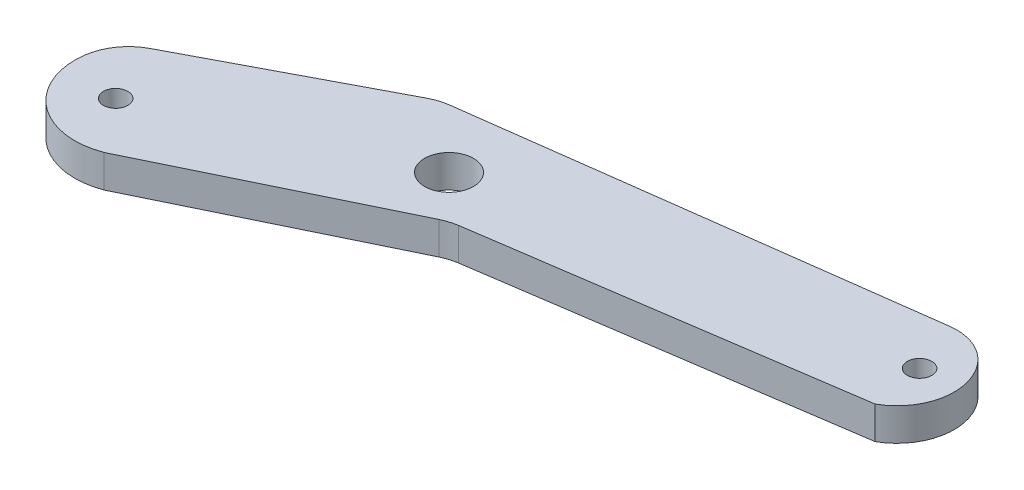
ISO-10303-21;
HEADER;
FILE_DESCRIPTION(('STEP AP214'),'2;1');
FILE_NAME('part.step','',(''),(''),'','','');
FILE_SCHEMA(('AUTOMOTIVE_DESIGN { 1 0 10303 214 1 1 1 1 }'));
ENDSEC;
DATA;
#1=APPLICATION_CONTEXT('core data for automotive mechanical design processes');
#2=APPLICATION_PROTOCOL_DEFINITION('international standard','automotive_design',2000,#1);
#3=PRODUCT_CONTEXT('',#1,'mechanical');
#4=PRODUCT('Part','Part','',(#3));
#5=PRODUCT_RELATED_PRODUCT_CATEGORY('part','',(#4));
#6=PRODUCT_DEFINITION_FORMATION('','',#4);
#7=PRODUCT_DEFINITION_CONTEXT('part definition',#1,'design');
#8=PRODUCT_DEFINITION('design','',#6,#7);
#9=PRODUCT_DEFINITION_SHAPE('','',#8);
#10=(LENGTH_UNIT() NAMED_UNIT(*) SI_UNIT(.MILLI.,.METRE.));
#11=(NAMED_UNIT(*) PLANE_ANGLE_UNIT() SI_UNIT($,.RADIAN.));
#12=(NAMED_UNIT(*) SI_UNIT($,.STERADIAN.) SOLID_ANGLE_UNIT());
#13=UNCERTAINTY_MEASURE_WITH_UNIT(LENGTH_MEASURE(1.E-05),#10,'distance_accuracy_value','');
#14=(GEOMETRIC_REPRESENTATION_CONTEXT(3) GLOBAL_UNCERTAINTY_ASSIGNED_CONTEXT((#13)) GLOBAL_UNIT_ASSIGNED_CONTEXT((#10,
#11,#12)) REPRESENTATION_CONTEXT('',''));
#15=CARTESIAN_POINT('',(0.,0.,0.));
#16=DIRECTION('',(0.,0.,1.));
#17=DIRECTION('',(1.,0.,0.));
#18=AXIS2_PLACEMENT_3D('',#15,#16,#17);
#19=CARTESIAN_POINT('',(99.400810461425,6.35,-16.6848029101456));
#20=DIRECTION('',(0.,-1.,0.));
#21=DIRECTION('',(0.,0.,-1.));
#22=AXIS2_PLACEMENT_3D('',#19,#20,#21);
#23=CYLINDRICAL_SURFACE('',#22,10.);
#24=CARTESIAN_POINT('',(99.400810461425,0.,-16.6848029101456));
#25=DIRECTION('',(0.,1.,0.));
#26=DIRECTION('',(0.,0.,1.));
#27=AXIS2_PLACEMENT_3D('',#24,#25,#26);
#28=CIRCLE('',#27,10.);
#29=CARTESIAN_POINT('',(98.0898795864605,0.,-26.5985035431618));
#30=VERTEX_POINT('',#29);
#31=CARTESIAN_POINT('',(107.24048218772,0.,-22.8928257213098));
#32=VERTEX_POINT('',#31);
#33=EDGE_CURVE('E157',#30,#32,#28,.F.);
#34=ORIENTED_EDGE('',*,*,#33,.F.);
#35=DIRECTION('',(0.,-1.,0.));
#36=VECTOR('',#35,1.);
#37=CARTESIAN_POINT('',(98.0898795864605,6.35,-26.5985035431618));
#38=LINE('',#37,#36);
#39=CARTESIAN_POINT('',(98.0898795864605,6.35,-26.5985035431618));
#40=VERTEX_POINT('',#39);
#41=EDGE_CURVE('E11',#40,#30,#38,.T.);
#42=ORIENTED_EDGE('',*,*,#41,.F.);
#43=CARTESIAN_POINT('',(99.400810461425,6.35,-16.6848029101456));
#44=DIRECTION('',(0.,1.,0.));
#45=DIRECTION('',(0.,0.,1.));
#46=AXIS2_PLACEMENT_3D('',#43,#44,#45);
#47=CIRCLE('',#46,10.);
#48=CARTESIAN_POINT('',(107.24048218772,6.35,-22.8928257213098));
#49=VERTEX_POINT('',#48);
#50=EDGE_CURVE('E191',#40,#49,#47,.F.);
#51=ORIENTED_EDGE('',*,*,#50,.T.);
#52=DIRECTION('',(0.,-1.,0.));
#53=VECTOR('',#52,1.);
#54=CARTESIAN_POINT('',(107.24048218772,6.35,-22.8928257213098));
#55=LINE('',#54,#53);
#56=EDGE_CURVE('E59',#49,#32,#55,.T.);
#57=ORIENTED_EDGE('',*,*,#56,.T.);
#58=EDGE_LOOP('',(#34,#42,#51,#57));
#59=FACE_BOUND('',#58,.T.);
#60=ADVANCED_FACE('F43',(#59),#23,.T.);
#61=CARTESIAN_POINT('',(-1.77107481881051,6.35,-13.3934640549495));
#62=DIRECTION('',(-0.131093087496452,0.,-0.991370063301615));
#63=DIRECTION('',(-0.991370063301615,0.,0.131093087496452));
#64=AXIS2_PLACEMENT_3D('',#61,#62,#63);
#65=PLANE('',#64);
#66=DIRECTION('',(0.991370063301615,0.,-0.131093087496452));
#67=VECTOR('',#66,1.);
#68=CARTESIAN_POINT('',(-1.77107481881051,0.,-13.3934640549495));
#69=LINE('',#68,#67);
#70=CARTESIAN_POINT('',(11.9511267409389,0.,-15.2080092347033));
#71=VERTEX_POINT('',#70);
#72=EDGE_CURVE('E159',#71,#30,#69,.T.);
#73=ORIENTED_EDGE('',*,*,#72,.F.);
#74=DIRECTION('',(0.,-1.,0.));
#75=VECTOR('',#74,1.);
#76=CARTESIAN_POINT('',(11.9511267409389,6.35,-15.2080092347033));
#77=LINE('',#76,#75);
#78=CARTESIAN_POINT('',(11.9511267409389,6.35,-15.2080092347033));
#79=VERTEX_POINT('',#78);
#80=EDGE_CURVE('E51',#79,#71,#77,.T.);
#81=ORIENTED_EDGE('',*,*,#80,.F.);
#82=DIRECTION('',(0.991370063301615,0.,-0.131093087496452));
#83=VECTOR('',#82,1.);
#84=CARTESIAN_POINT('',(-1.77107481881051,6.35,-13.3934640549495));
#85=LINE('',#84,#83);
#86=EDGE_CURVE('E218',#79,#40,#85,.T.);
#87=ORIENTED_EDGE('',*,*,#86,.T.);
#88=ORIENTED_EDGE('',*,*,#41,.T.);
#89=EDGE_LOOP('',(#73,#81,#87,#88));
#90=FACE_BOUND('',#89,.T.);
#91=ADVANCED_FACE('F217',(#90),#65,.T.);
#92=CARTESIAN_POINT('',(13.2620576159034,6.35,-5.29430860168714));
#93=DIRECTION('',(0.,-1.,0.));
#94=DIRECTION('',(0.,0.,-1.));
#95=AXIS2_PLACEMENT_3D('',#92,#93,#94);
#96=CYLINDRICAL_SURFACE('',#95,10.);
#97=CARTESIAN_POINT('',(13.2620576159034,0.,-5.29430860168714));
#98=DIRECTION('',(0.,1.,0.));
#99=DIRECTION('',(0.,0.,1.));
#100=AXIS2_PLACEMENT_3D('',#97,#98,#99);
#101=CIRCLE('',#100,10.);
#102=CARTESIAN_POINT('',(8.61159413979149,0.,-14.1471719496299));
#103=VERTEX_POINT('',#102);
#104=EDGE_CURVE('E162',#71,#103,#101,.T.);
#105=ORIENTED_EDGE('',*,*,#104,.T.);
#106=DIRECTION('',(0.,-1.,0.));
#107=VECTOR('',#106,1.);
#108=CARTESIAN_POINT('',(8.61159413979149,6.35,-14.1471719496299));
#109=LINE('',#108,#107);
#110=CARTESIAN_POINT('',(8.61159413979149,6.35,-14.1471719496299));
#111=VERTEX_POINT('',#110);
#112=EDGE_CURVE('E201',#111,#103,#109,.T.);
#113=ORIENTED_EDGE('',*,*,#112,.F.);
#114=CARTESIAN_POINT('',(13.2620576159034,6.35,-5.29430860168714));
#115=DIRECTION('',(0.,1.,0.));
#116=DIRECTION('',(0.,0.,1.));
#117=AXIS2_PLACEMENT_3D('',#114,#115,#116);
#118=CIRCLE('',#117,10.);
#119=EDGE_CURVE('E208',#79,#111,#118,.T.);
#120=ORIENTED_EDGE('',*,*,#119,.F.);
#121=ORIENTED_EDGE('',*,*,#80,.T.);
#122=EDGE_LOOP('',(#105,#113,#120,#121));
#123=FACE_BOUND('',#122,.T.);
#124=ADVANCED_FACE('F206',(#123),#96,.T.);
#125=CARTESIAN_POINT('',(-3.96196589337099,6.35,-7.54220365849386));
#126=DIRECTION('',(0.465046347611194,0.,0.885286334794279));
#127=DIRECTION('',(0.885286334794279,0.,-0.465046347611194));
#128=AXIS2_PLACEMENT_3D('',#125,#126,#127);
#129=PLANE('',#128);
#130=DIRECTION('',(-0.885286334794279,0.,0.465046347611194));
#131=VECTOR('',#130,1.);
#132=CARTESIAN_POINT('',(-3.96196589337099,0.,-7.54220365849386));
#133=LINE('',#132,#131);
#134=CARTESIAN_POINT('',(-26.7513025622144,0.,4.42917482753039));
#135=VERTEX_POINT('',#134);
#136=EDGE_CURVE('E164',#103,#135,#133,.T.);
#137=ORIENTED_EDGE('',*,*,#136,.T.);
#138=DIRECTION('',(0.,-1.,0.));
#139=VECTOR('',#138,1.);
#140=CARTESIAN_POINT('',(-26.7513025622144,6.35,4.42917482753039));
#141=LINE('',#140,#139);
#142=CARTESIAN_POINT('',(-26.7513025622144,6.35,4.42917482753039));
#143=VERTEX_POINT('',#142);
#144=EDGE_CURVE('E199',#143,#135,#141,.T.);
#145=ORIENTED_EDGE('',*,*,#144,.F.);
#146=DIRECTION('',(-0.885286334794279,0.,0.465046347611194));
#147=VECTOR('',#146,1.);
#148=CARTESIAN_POINT('',(-3.96196589337099,6.35,-7.54220365849386));
#149=LINE('',#148,#147);
#150=EDGE_CURVE('E402',#111,#143,#149,.T.);
#151=ORIENTED_EDGE('',*,*,#150,.F.);
#152=ORIENTED_EDGE('',*,*,#112,.T.);
#153=EDGE_LOOP('',(#137,#145,#151,#152));
#154=FACE_BOUND('',#153,.T.);
#155=ADVANCED_FACE('F241',(#154),#129,.F.);
#156=CARTESIAN_POINT('',(-22.1008390861025,6.35,13.2820381754732));
#157=DIRECTION('',(0.,-1.,0.));
#158=DIRECTION('',(0.,0.,-1.));
#159=AXIS2_PLACEMENT_3D('',#156,#157,#158);
#160=CYLINDRICAL_SURFACE('',#159,10.);
#161=CARTESIAN_POINT('',(-22.1008390861025,0.,13.2820381754732));
#162=DIRECTION('',(0.,1.,0.));
#163=DIRECTION('',(0.,0.,1.));
#164=AXIS2_PLACEMENT_3D('',#161,#162,#163);
#165=CIRCLE('',#164,10.);
#166=CARTESIAN_POINT('',(-32.0126384037366,0.,11.9568082758145));
#167=VERTEX_POINT('',#166);
#168=EDGE_CURVE('E167',#167,#135,#165,.F.);
#169=ORIENTED_EDGE('',*,*,#168,.F.);
#170=DIRECTION('',(0.,-1.,0.));
#171=VECTOR('',#170,1.);
#172=CARTESIAN_POINT('',(-32.0126384037366,6.35,11.9568082758145));
#173=LINE('',#172,#171);
#174=CARTESIAN_POINT('',(-32.0126384037366,6.35,11.9568082758145));
#175=VERTEX_POINT('',#174);
#176=EDGE_CURVE('E197',#175,#167,#173,.T.);
#177=ORIENTED_EDGE('',*,*,#176,.F.);
#178=CARTESIAN_POINT('',(-22.1008390861025,6.35,13.2820381754732));
#179=DIRECTION('',(0.,1.,0.));
#180=DIRECTION('',(0.,0.,1.));
#181=AXIS2_PLACEMENT_3D('',#178,#179,#180);
#182=CIRCLE('',#181,10.);
#183=EDGE_CURVE('E400',#175,#143,#182,.F.);
#184=ORIENTED_EDGE('',*,*,#183,.T.);
#185=ORIENTED_EDGE('',*,*,#144,.T.);
#186=EDGE_LOOP('',(#169,#177,#184,#185));
#187=FACE_BOUND('',#186,.T.);
#188=ADVANCED_FACE('F246',(#187),#160,.T.);
#189=CARTESIAN_POINT('',(-18.5273450422471,6.35,13.7598223800771));
#190=DIRECTION('',(0.,-1.,0.));
#191=DIRECTION('',(0.,0.,-1.));
#192=AXIS2_PLACEMENT_3D('',#189,#190,#191);
#193=CYLINDRICAL_SURFACE('',#192,13.6052929738981);
#194=CARTESIAN_POINT('',(-18.5273450422471,0.,13.7598223800771));
#195=DIRECTION('',(0.,1.,0.));
#196=DIRECTION('',(0.,0.,1.));
#197=AXIS2_PLACEMENT_3D('',#194,#195,#196);
#198=CIRCLE('',#197,13.6052929738981);
#199=CARTESIAN_POINT('',(-13.7071323255182,0.,26.4826187028627));
#200=VERTEX_POINT('',#199);
#201=EDGE_CURVE('E170',#167,#200,#198,.T.);
#202=ORIENTED_EDGE('',*,*,#201,.T.);
#203=DIRECTION('',(0.,-1.,0.));
#204=VECTOR('',#203,1.);
#205=CARTESIAN_POINT('',(-13.7071323255182,6.35,26.4826187028627));
#206=LINE('',#205,#204);
#207=CARTESIAN_POINT('',(-13.7071323255182,6.35,26.4826187028627));
#208=VERTEX_POINT('',#207);
#209=EDGE_CURVE('E195',#208,#200,#206,.T.);
#210=ORIENTED_EDGE('',*,*,#209,.F.);
#211=CARTESIAN_POINT('',(-18.5273450422471,6.35,13.7598223800771));
#212=DIRECTION('',(0.,1.,0.));
#213=DIRECTION('',(0.,0.,1.));
#214=AXIS2_PLACEMENT_3D('',#211,#212,#213);
#215=CIRCLE('',#214,13.6052929738981);
#216=EDGE_CURVE('E404',#175,#208,#215,.T.);
#217=ORIENTED_EDGE('',*,*,#216,.F.);
#218=ORIENTED_EDGE('',*,*,#176,.T.);
#219=EDGE_LOOP('',(#202,#210,#217,#218));
#220=FACE_BOUND('',#219,.T.);
#221=ADVANCED_FACE('F250',(#220),#193,.T.);
#222=CARTESIAN_POINT('',(7.78824916958506,6.35,16.0557162625143));
#223=DIRECTION('',(0.436439537142603,0.,0.899733588579836));
#224=DIRECTION('',(0.899733588579836,0.,-0.436439537142603));
#225=AXIS2_PLACEMENT_3D('',#222,#223,#224);
#226=PLANE('',#225);
#227=DIRECTION('',(-0.899733588579836,0.,0.436439537142603));
#228=VECTOR('',#227,1.);
#229=CARTESIAN_POINT('',(7.78824916958506,0.,16.0557162625143));
#230=LINE('',#229,#228);
#231=CARTESIAN_POINT('',(30.2791552536033,0.,5.14590833067922));
#232=VERTEX_POINT('',#231);
#233=EDGE_CURVE('E173',#232,#200,#230,.T.);
#234=ORIENTED_EDGE('',*,*,#233,.F.);
#235=DIRECTION('',(0.,-1.,0.));
#236=VECTOR('',#235,1.);
#237=CARTESIAN_POINT('',(30.2791552536033,6.35,5.14590833067922));
#238=LINE('',#237,#236);
#239=CARTESIAN_POINT('',(30.2791552536033,6.35,5.14590833067922));
#240=VERTEX_POINT('',#239);
#241=EDGE_CURVE('E130',#240,#232,#238,.T.);
#242=ORIENTED_EDGE('',*,*,#241,.F.);
#243=DIRECTION('',(-0.899733588579836,0.,0.436439537142603));
#244=VECTOR('',#243,1.);
#245=CARTESIAN_POINT('',(7.78824916958506,6.35,16.0557162625143));
#246=LINE('',#245,#244);
#247=EDGE_CURVE('E140',#240,#208,#246,.T.);
#248=ORIENTED_EDGE('',*,*,#247,.T.);
#249=ORIENTED_EDGE('',*,*,#209,.T.);
#250=EDGE_LOOP('',(#234,#242,#248,#249));
#251=FACE_BOUND('',#250,.T.);
#252=ADVANCED_FACE('F254',(#251),#226,.T.);
#253=CARTESIAN_POINT('',(34.6435506250294,6.35,14.1432442164776));
#254=DIRECTION('',(0.,-1.,0.));
#255=DIRECTION('',(0.,0.,-1.));
#256=AXIS2_PLACEMENT_3D('',#253,#254,#255);
#257=CYLINDRICAL_SURFACE('',#256,10.);
#258=CARTESIAN_POINT('',(34.6435506250294,0.,14.1432442164776));
#259=DIRECTION('',(0.,1.,0.));
#260=DIRECTION('',(0.,0.,1.));
#261=AXIS2_PLACEMENT_3D('',#258,#259,#260);
#262=CIRCLE('',#261,10.);
#263=CARTESIAN_POINT('',(33.1827203394052,0.,4.2505208868477));
#264=VERTEX_POINT('',#263);
#265=EDGE_CURVE('E126',#264,#232,#262,.T.);
#266=ORIENTED_EDGE('',*,*,#265,.F.);
#267=DIRECTION('',(0.,-1.,0.));
#268=VECTOR('',#267,1.);
#269=CARTESIAN_POINT('',(33.1827203394052,6.35,4.2505208868477));
#270=LINE('',#269,#268);
#271=CARTESIAN_POINT('',(33.1827203394052,6.35,4.2505208868477));
#272=VERTEX_POINT('',#271);
#273=EDGE_CURVE('E121',#272,#264,#270,.T.);
#274=ORIENTED_EDGE('',*,*,#273,.F.);
#275=CARTESIAN_POINT('',(34.6435506250294,6.35,14.1432442164776));
#276=DIRECTION('',(0.,1.,0.));
#277=DIRECTION('',(0.,0.,1.));
#278=AXIS2_PLACEMENT_3D('',#275,#276,#277);
#279=CIRCLE('',#278,10.);
#280=EDGE_CURVE('E124',#272,#240,#279,.T.);
#281=ORIENTED_EDGE('',*,*,#280,.T.);
#282=ORIENTED_EDGE('',*,*,#241,.T.);
#283=EDGE_LOOP('',(#266,#274,#281,#282));
#284=FACE_BOUND('',#283,.T.);
#285=ADVANCED_FACE('F123',(#284),#257,.F.);
#286=CARTESIAN_POINT('',(1.32239543360716,6.35,8.95524434684925));
#287=DIRECTION('',(0.146083028562412,0.,0.989272332962988));
#288=DIRECTION('',(0.989272332962988,0.,-0.146083028562412));
#289=AXIS2_PLACEMENT_3D('',#286,#287,#288);
#290=PLANE('',#289);
#291=DIRECTION('',(-0.989272332962988,0.,0.146083028562412));
#292=VECTOR('',#291,1.);
#293=CARTESIAN_POINT('',(1.32239543360716,0.,8.95524434684925));
#294=LINE('',#293,#292);
#295=CARTESIAN_POINT('',(103.955940894977,0.,-6.20035907348395));
#296=VERTEX_POINT('',#295);
#297=EDGE_CURVE('E177',#296,#264,#294,.T.);
#298=ORIENTED_EDGE('',*,*,#297,.F.);
#299=DIRECTION('',(0.,-1.,0.));
#300=VECTOR('',#299,1.);
#301=CARTESIAN_POINT('',(103.955940894977,6.35,-6.20035907348395));
#302=LINE('',#301,#300);
#303=CARTESIAN_POINT('',(103.955940894977,6.35,-6.20035907348395));
#304=VERTEX_POINT('',#303);
#305=EDGE_CURVE('E90',#304,#296,#302,.T.);
#306=ORIENTED_EDGE('',*,*,#305,.F.);
#307=DIRECTION('',(-0.989272332962988,0.,0.146083028562412));
#308=VECTOR('',#307,1.);
#309=CARTESIAN_POINT('',(1.32239543360716,6.35,8.95524434684925));
#310=LINE('',#309,#308);
#311=EDGE_CURVE('E138',#304,#272,#310,.T.);
#312=ORIENTED_EDGE('',*,*,#311,.T.);
#313=ORIENTED_EDGE('',*,*,#273,.T.);
#314=EDGE_LOOP('',(#298,#306,#312,#313));
#315=FACE_BOUND('',#314,.T.);
#316=ADVANCED_FACE('F142',(#315),#290,.T.);
#317=CARTESIAN_POINT('',(23.3062872183733,6.35,-3.77479484140407));
#318=DIRECTION('',(0.,-1.,0.));
#319=DIRECTION('',(0.,0.,-1.));
#320=AXIS2_PLACEMENT_3D('',#317,#318,#319);
#321=CYLINDRICAL_SURFACE('',#320,4.7625);
#322=CARTESIAN_POINT('',(23.3062872183733,6.35,-3.77479484140407));
#323=DIRECTION('',(0.,1.,0.));
#324=DIRECTION('',(0.,0.,1.));
#325=AXIS2_PLACEMENT_3D('',#322,#323,#324);
#326=CIRCLE('',#325,4.7625);
#327=CARTESIAN_POINT('',(23.3062872183733,6.35,0.987705158595934));
#328=VERTEX_POINT('',#327);
#329=EDGE_CURVE('E151',#328,#328,#326,.T.);
#330=ORIENTED_EDGE('',*,*,#329,.T.);
#331=EDGE_LOOP('',(#330));
#332=FACE_BOUND('',#331,.T.);
#333=CARTESIAN_POINT('',(23.3062872183733,0.,-3.77479484140407));
#334=DIRECTION('',(0.,1.,0.));
#335=DIRECTION('',(0.,0.,1.));
#336=AXIS2_PLACEMENT_3D('',#333,#334,#335);
#337=CIRCLE('',#336,4.7625);
#338=CARTESIAN_POINT('',(23.3062872183733,0.,0.987705158595934));
#339=VERTEX_POINT('',#338);
#340=EDGE_CURVE('E185',#339,#339,#337,.T.);
#341=ORIENTED_EDGE('',*,*,#340,.F.);
#342=EDGE_LOOP('',(#341));
#343=FACE_BOUND('',#342,.T.);
#344=ADVANCED_FACE('F230',(#332,#343),#321,.F.);
#345=CARTESIAN_POINT('',(-21.6937127816267,6.35,16.225205158596));
#346=DIRECTION('',(0.,-1.,0.));
#347=DIRECTION('',(0.,0.,-1.));
#348=AXIS2_PLACEMENT_3D('',#345,#346,#347);
#349=CYLINDRICAL_SURFACE('',#348,2.38125);
#350=CARTESIAN_POINT('',(-21.6937127816267,6.35,16.225205158596));
#351=DIRECTION('',(0.,1.,0.));
#352=DIRECTION('',(0.,0.,1.));
#353=AXIS2_PLACEMENT_3D('',#350,#351,#352);
#354=CIRCLE('',#353,2.38125);
#355=CARTESIAN_POINT('',(-21.6937127816267,6.35,18.606455158596));
#356=VERTEX_POINT('',#355);
#357=EDGE_CURVE('E145',#356,#356,#354,.T.);
#358=ORIENTED_EDGE('',*,*,#357,.T.);
#359=EDGE_LOOP('',(#358));
#360=FACE_BOUND('',#359,.T.);
#361=CARTESIAN_POINT('',(-21.6937127816267,0.,16.225205158596));
#362=DIRECTION('',(0.,1.,0.));
#363=DIRECTION('',(0.,0.,1.));
#364=AXIS2_PLACEMENT_3D('',#361,#362,#363);
#365=CIRCLE('',#364,2.38125);
#366=CARTESIAN_POINT('',(-21.6937127816267,0.,18.606455158596));
#367=VERTEX_POINT('',#366);
#368=EDGE_CURVE('E182',#367,#367,#365,.T.);
#369=ORIENTED_EDGE('',*,*,#368,.F.);
#370=EDGE_LOOP('',(#369));
#371=FACE_BOUND('',#370,.T.);
#372=ADVANCED_FACE('F222',(#360,#371),#349,.F.);
#373=CARTESIAN_POINT('',(98.4714930155298,6.35,-15.9489017009687));
#374=DIRECTION('',(0.,-1.,0.));
#375=DIRECTION('',(0.,0.,-1.));
#376=AXIS2_PLACEMENT_3D('',#373,#374,#375);
#377=CYLINDRICAL_SURFACE('',#376,11.1854035198671);
#378=CARTESIAN_POINT('',(98.4714930155298,0.,-15.9489017009687));
#379=DIRECTION('',(0.,1.,0.));
#380=DIRECTION('',(0.,0.,1.));
#381=AXIS2_PLACEMENT_3D('',#378,#379,#380);
#382=CIRCLE('',#381,11.1854035198671);
#383=EDGE_CURVE('E179',#32,#296,#382,.F.);
#384=ORIENTED_EDGE('',*,*,#383,.F.);
#385=ORIENTED_EDGE('',*,*,#56,.F.);
#386=CARTESIAN_POINT('',(98.4714930155298,6.35,-15.9489017009687));
#387=DIRECTION('',(0.,1.,0.));
#388=DIRECTION('',(0.,0.,1.));
#389=AXIS2_PLACEMENT_3D('',#386,#387,#388);
#390=CIRCLE('',#389,11.1854035198671);
#391=EDGE_CURVE('E143',#49,#304,#390,.F.);
#392=ORIENTED_EDGE('',*,*,#391,.T.);
#393=ORIENTED_EDGE('',*,*,#305,.T.);
#394=EDGE_LOOP('',(#384,#385,#392,#393));
#395=FACE_BOUND('',#394,.T.);
#396=ADVANCED_FACE('F219',(#395),#377,.T.);
#397=CARTESIAN_POINT('',(102.277188424212,6.35,-16.5652898567503));
#398=DIRECTION('',(0.,-1.,0.));
#399=DIRECTION('',(0.,0.,-1.));
#400=AXIS2_PLACEMENT_3D('',#397,#398,#399);
#401=CYLINDRICAL_SURFACE('',#400,2.38125000000001);
#402=CARTESIAN_POINT('',(102.277188424212,6.35,-16.5652898567503));
#403=DIRECTION('',(0.,1.,0.));
#404=DIRECTION('',(0.,0.,1.));
#405=AXIS2_PLACEMENT_3D('',#402,#403,#404);
#406=CIRCLE('',#405,2.38125000000001);
#407=CARTESIAN_POINT('',(102.277188424212,6.35,-14.1840398567503));
#408=VERTEX_POINT('',#407);
#409=EDGE_CURVE('E154',#408,#408,#406,.T.);
#410=ORIENTED_EDGE('',*,*,#409,.T.);
#411=EDGE_LOOP('',(#410));
#412=FACE_BOUND('',#411,.T.);
#413=CARTESIAN_POINT('',(102.277188424212,0.,-16.5652898567503));
#414=DIRECTION('',(0.,1.,0.));
#415=DIRECTION('',(0.,0.,1.));
#416=AXIS2_PLACEMENT_3D('',#413,#414,#415);
#417=CIRCLE('',#416,2.38125000000001);
#418=CARTESIAN_POINT('',(102.277188424212,0.,-14.1840398567503));
#419=VERTEX_POINT('',#418);
#420=EDGE_CURVE('E188',#419,#419,#417,.T.);
#421=ORIENTED_EDGE('',*,*,#420,.F.);
#422=EDGE_LOOP('',(#421));
#423=FACE_BOUND('',#422,.T.);
#424=ADVANCED_FACE('F221',(#412,#423),#401,.F.);
#425=CARTESIAN_POINT('',(0.,6.35,0.));
#426=DIRECTION('',(0.,1.,0.));
#427=DIRECTION('',(0.,0.,1.));
#428=AXIS2_PLACEMENT_3D('',#425,#426,#427);
#429=PLANE('',#428);
#430=ORIENTED_EDGE('',*,*,#50,.F.);
#431=ORIENTED_EDGE('',*,*,#86,.F.);
#432=ORIENTED_EDGE('',*,*,#119,.T.);
#433=ORIENTED_EDGE('',*,*,#150,.T.);
#434=ORIENTED_EDGE('',*,*,#183,.F.);
#435=ORIENTED_EDGE('',*,*,#216,.T.);
#436=ORIENTED_EDGE('',*,*,#247,.F.);
#437=ORIENTED_EDGE('',*,*,#280,.F.);
#438=ORIENTED_EDGE('',*,*,#311,.F.);
#439=ORIENTED_EDGE('',*,*,#391,.F.);
#440=EDGE_LOOP('',(#430,#431,#432,#433,#434,#435,#436,#437,#438,#439));
#441=FACE_BOUND('',#440,.T.);
#442=ORIENTED_EDGE('',*,*,#357,.F.);
#443=EDGE_LOOP('',(#442));
#444=FACE_BOUND('',#443,.T.);
#445=ORIENTED_EDGE('',*,*,#329,.F.);
#446=EDGE_LOOP('',(#445));
#447=FACE_BOUND('',#446,.T.);
#448=ORIENTED_EDGE('',*,*,#409,.F.);
#449=EDGE_LOOP('',(#448));
#450=FACE_BOUND('',#449,.T.);
#451=ADVANCED_FACE('F135',(#441,#444,#447,#450),#429,.T.);
#452=CARTESIAN_POINT('',(0.,0.,0.));
#453=DIRECTION('',(0.,1.,0.));
#454=DIRECTION('',(0.,0.,1.));
#455=AXIS2_PLACEMENT_3D('',#452,#453,#454);
#456=PLANE('',#455);
#457=ORIENTED_EDGE('',*,*,#33,.T.);
#458=ORIENTED_EDGE('',*,*,#383,.T.);
#459=ORIENTED_EDGE('',*,*,#297,.T.);
#460=ORIENTED_EDGE('',*,*,#265,.T.);
#461=ORIENTED_EDGE('',*,*,#233,.T.);
#462=ORIENTED_EDGE('',*,*,#201,.F.);
#463=ORIENTED_EDGE('',*,*,#168,.T.);
#464=ORIENTED_EDGE('',*,*,#136,.F.);
#465=ORIENTED_EDGE('',*,*,#104,.F.);
#466=ORIENTED_EDGE('',*,*,#72,.T.);
#467=EDGE_LOOP('',(#457,#458,#459,#460,#461,#462,#463,#464,#465,#466));
#468=FACE_BOUND('',#467,.T.);
#469=ORIENTED_EDGE('',*,*,#368,.T.);
#470=EDGE_LOOP('',(#469));
#471=FACE_BOUND('',#470,.T.);
#472=ORIENTED_EDGE('',*,*,#340,.T.);
#473=EDGE_LOOP('',(#472));
#474=FACE_BOUND('',#473,.T.);
#475=ORIENTED_EDGE('',*,*,#420,.T.);
#476=EDGE_LOOP('',(#475));
#477=FACE_BOUND('',#476,.T.);
#478=ADVANCED_FACE('F215',(#468,#471,#474,#477),#456,.F.);
#479=CLOSED_SHELL('',(#60,#91,#124,#155,#188,#221,#252,#285,#316,#344,#372,#396,#424,#451,#478));
#480=MANIFOLD_SOLID_BREP('B2',#479);
#481=ADVANCED_BREP_SHAPE_REPRESENTATION('',(#18,#480),#14);
#482=SHAPE_DEFINITION_REPRESENTATION(#9,#481);
ENDSEC;
END-ISO-10303-21;
